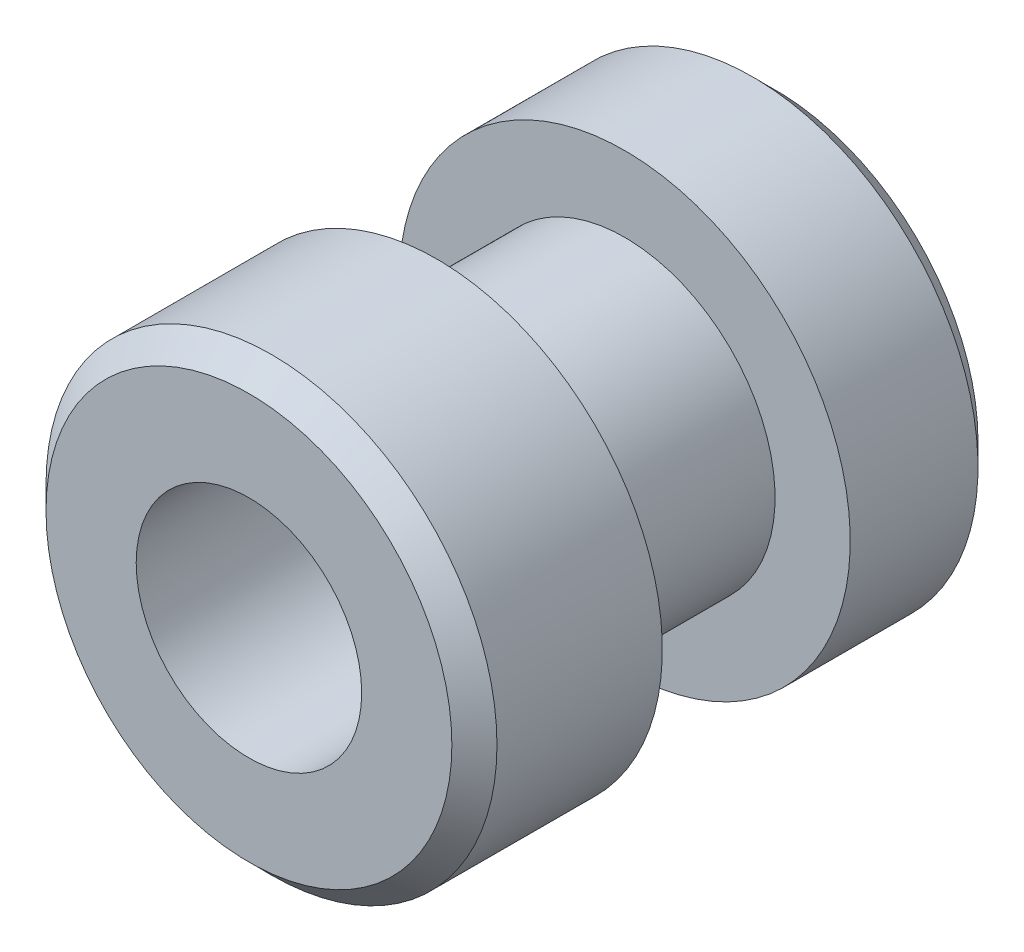
ISO-10303-21;
HEADER;
FILE_DESCRIPTION(('STEP AP214'),'2;1');
FILE_NAME('part.step','',(''),(''),'','','');
FILE_SCHEMA(('AUTOMOTIVE_DESIGN { 1 0 10303 214 1 1 1 1 }'));
ENDSEC;
DATA;
#1=APPLICATION_CONTEXT('core data for automotive mechanical design processes');
#2=APPLICATION_PROTOCOL_DEFINITION('international standard','automotive_design',2000,#1);
#3=PRODUCT_CONTEXT('',#1,'mechanical');
#4=PRODUCT('Part','Part','',(#3));
#5=PRODUCT_RELATED_PRODUCT_CATEGORY('part','',(#4));
#6=PRODUCT_DEFINITION_FORMATION('','',#4);
#7=PRODUCT_DEFINITION_CONTEXT('part definition',#1,'design');
#8=PRODUCT_DEFINITION('design','',#6,#7);
#9=PRODUCT_DEFINITION_SHAPE('','',#8);
#10=(LENGTH_UNIT() NAMED_UNIT(*) SI_UNIT(.MILLI.,.METRE.));
#11=(NAMED_UNIT(*) PLANE_ANGLE_UNIT() SI_UNIT($,.RADIAN.));
#12=(NAMED_UNIT(*) SI_UNIT($,.STERADIAN.) SOLID_ANGLE_UNIT());
#13=UNCERTAINTY_MEASURE_WITH_UNIT(LENGTH_MEASURE(1.E-05),#10,'distance_accuracy_value','');
#14=(GEOMETRIC_REPRESENTATION_CONTEXT(3) GLOBAL_UNCERTAINTY_ASSIGNED_CONTEXT((#13)) GLOBAL_UNIT_ASSIGNED_CONTEXT((#10,
#11,#12)) REPRESENTATION_CONTEXT('',''));
#15=CARTESIAN_POINT('',(0.,0.,0.));
#16=DIRECTION('',(0.,0.,1.));
#17=DIRECTION('',(1.,0.,0.));
#18=AXIS2_PLACEMENT_3D('',#15,#16,#17);
#19=CARTESIAN_POINT('',(0.,0.,-2.41303441791942));
#20=DIRECTION('',(0.,0.,-1.));
#21=DIRECTION('',(-1.,0.,0.));
#22=AXIS2_PLACEMENT_3D('',#19,#20,#21);
#23=CYLINDRICAL_SURFACE('',#22,3.);
#24=CARTESIAN_POINT('',(0.,0.,-0.300000000000001));
#25=DIRECTION('',(0.,0.,1.));
#26=DIRECTION('',(1.,0.,0.));
#27=AXIS2_PLACEMENT_3D('',#24,#25,#26);
#28=CIRCLE('',#27,3.);
#29=CARTESIAN_POINT('',(3.,0.,-0.300000000000001));
#30=VERTEX_POINT('',#29);
#31=EDGE_CURVE('E54',#30,#30,#28,.F.);
#32=ORIENTED_EDGE('',*,*,#31,.T.);
#33=EDGE_LOOP('',(#32));
#34=FACE_BOUND('',#33,.T.);
#35=CARTESIAN_POINT('',(0.,0.,-2.5));
#36=DIRECTION('',(0.,0.,-1.));
#37=DIRECTION('',(-1.,0.,0.));
#38=AXIS2_PLACEMENT_3D('',#35,#36,#37);
#39=CIRCLE('',#38,3.);
#40=CARTESIAN_POINT('',(-3.,0.,-2.5));
#41=VERTEX_POINT('',#40);
#42=EDGE_CURVE('E74',#41,#41,#39,.T.);
#43=ORIENTED_EDGE('',*,*,#42,.F.);
#44=EDGE_LOOP('',(#43));
#45=FACE_BOUND('',#44,.T.);
#46=ADVANCED_FACE('F38',(#34,#45),#23,.T.);
#47=CARTESIAN_POINT('',(-3.,0.,0.));
#48=DIRECTION('',(0.,0.,1.));
#49=DIRECTION('',(1.,0.,0.));
#50=AXIS2_PLACEMENT_3D('',#47,#48,#49);
#51=PLANE('',#50);
#52=CARTESIAN_POINT('',(0.,0.,0.));
#53=DIRECTION('',(0.,0.,1.));
#54=DIRECTION('',(1.,0.,0.));
#55=AXIS2_PLACEMENT_3D('',#52,#53,#54);
#56=CIRCLE('',#55,2.7);
#57=CARTESIAN_POINT('',(2.7,0.,0.));
#58=VERTEX_POINT('',#57);
#59=EDGE_CURVE('E50',#58,#58,#56,.T.);
#60=ORIENTED_EDGE('',*,*,#59,.T.);
#61=EDGE_LOOP('',(#60));
#62=FACE_BOUND('',#61,.T.);
#63=CARTESIAN_POINT('',(0.,0.,0.));
#64=DIRECTION('',(0.,0.,-1.));
#65=DIRECTION('',(-1.,0.,0.));
#66=AXIS2_PLACEMENT_3D('',#63,#64,#65);
#67=CIRCLE('',#66,1.5);
#68=CARTESIAN_POINT('',(-1.5,0.,0.));
#69=VERTEX_POINT('',#68);
#70=EDGE_CURVE('E59',#69,#69,#67,.T.);
#71=ORIENTED_EDGE('',*,*,#70,.T.);
#72=EDGE_LOOP('',(#71));
#73=FACE_BOUND('',#72,.T.);
#74=ADVANCED_FACE('F82',(#62,#73),#51,.T.);
#75=CARTESIAN_POINT('',(0.,0.,-2.41303441791942));
#76=DIRECTION('',(0.,0.,-1.));
#77=DIRECTION('',(-1.,0.,0.));
#78=AXIS2_PLACEMENT_3D('',#75,#76,#77);
#79=CYLINDRICAL_SURFACE('',#78,1.5);
#80=CARTESIAN_POINT('',(0.,0.,-7.));
#81=DIRECTION('',(0.,0.,-1.));
#82=DIRECTION('',(-1.,0.,0.));
#83=AXIS2_PLACEMENT_3D('',#80,#81,#82);
#84=CIRCLE('',#83,1.5);
#85=CARTESIAN_POINT('',(-1.5,0.,-7.));
#86=VERTEX_POINT('',#85);
#87=EDGE_CURVE('E62',#86,#86,#84,.T.);
#88=ORIENTED_EDGE('',*,*,#87,.T.);
#89=EDGE_LOOP('',(#88));
#90=FACE_BOUND('',#89,.T.);
#91=ORIENTED_EDGE('',*,*,#70,.F.);
#92=EDGE_LOOP('',(#91));
#93=FACE_BOUND('',#92,.T.);
#94=ADVANCED_FACE('F88',(#90,#93),#79,.F.);
#95=CARTESIAN_POINT('',(-1.5,0.,-7.));
#96=DIRECTION('',(0.,0.,-1.));
#97=DIRECTION('',(-1.,0.,0.));
#98=AXIS2_PLACEMENT_3D('',#95,#96,#97);
#99=PLANE('',#98);
#100=CARTESIAN_POINT('',(0.,0.,-7.));
#101=DIRECTION('',(0.,0.,-1.));
#102=DIRECTION('',(-1.,0.,0.));
#103=AXIS2_PLACEMENT_3D('',#100,#101,#102);
#104=CIRCLE('',#103,2.7);
#105=CARTESIAN_POINT('',(-2.7,0.,-7.));
#106=VERTEX_POINT('',#105);
#107=EDGE_CURVE('E46',#106,#106,#104,.T.);
#108=ORIENTED_EDGE('',*,*,#107,.T.);
#109=EDGE_LOOP('',(#108));
#110=FACE_BOUND('',#109,.T.);
#111=ORIENTED_EDGE('',*,*,#87,.F.);
#112=EDGE_LOOP('',(#111));
#113=FACE_BOUND('',#112,.T.);
#114=ADVANCED_FACE('F112',(#110,#113),#99,.T.);
#115=CARTESIAN_POINT('',(0.,0.,-2.41303441791942));
#116=DIRECTION('',(0.,0.,-1.));
#117=DIRECTION('',(-1.,0.,0.));
#118=AXIS2_PLACEMENT_3D('',#115,#116,#117);
#119=CYLINDRICAL_SURFACE('',#118,3.);
#120=CARTESIAN_POINT('',(0.,0.,-6.7));
#121=DIRECTION('',(0.,0.,-1.));
#122=DIRECTION('',(-1.,0.,0.));
#123=AXIS2_PLACEMENT_3D('',#120,#121,#122);
#124=CIRCLE('',#123,3.);
#125=CARTESIAN_POINT('',(-3.,0.,-6.7));
#126=VERTEX_POINT('',#125);
#127=EDGE_CURVE('E10',#126,#126,#124,.F.);
#128=ORIENTED_EDGE('',*,*,#127,.T.);
#129=EDGE_LOOP('',(#128));
#130=FACE_BOUND('',#129,.T.);
#131=CARTESIAN_POINT('',(0.,0.,-5.));
#132=DIRECTION('',(0.,0.,-1.));
#133=DIRECTION('',(-1.,0.,0.));
#134=AXIS2_PLACEMENT_3D('',#131,#132,#133);
#135=CIRCLE('',#134,3.);
#136=CARTESIAN_POINT('',(-3.,0.,-5.));
#137=VERTEX_POINT('',#136);
#138=EDGE_CURVE('E65',#137,#137,#135,.T.);
#139=ORIENTED_EDGE('',*,*,#138,.T.);
#140=EDGE_LOOP('',(#139));
#141=FACE_BOUND('',#140,.T.);
#142=ADVANCED_FACE('F117',(#130,#141),#119,.T.);
#143=CARTESIAN_POINT('',(-3.,0.,-5.));
#144=DIRECTION('',(0.,0.,1.));
#145=DIRECTION('',(1.,0.,0.));
#146=AXIS2_PLACEMENT_3D('',#143,#144,#145);
#147=PLANE('',#146);
#148=CARTESIAN_POINT('',(0.,0.,-5.));
#149=DIRECTION('',(0.,0.,-1.));
#150=DIRECTION('',(-1.,0.,0.));
#151=AXIS2_PLACEMENT_3D('',#148,#149,#150);
#152=CIRCLE('',#151,2.);
#153=CARTESIAN_POINT('',(-2.,0.,-5.));
#154=VERTEX_POINT('',#153);
#155=EDGE_CURVE('E68',#154,#154,#152,.T.);
#156=ORIENTED_EDGE('',*,*,#155,.T.);
#157=EDGE_LOOP('',(#156));
#158=FACE_BOUND('',#157,.T.);
#159=ORIENTED_EDGE('',*,*,#138,.F.);
#160=EDGE_LOOP('',(#159));
#161=FACE_BOUND('',#160,.T.);
#162=ADVANCED_FACE('F122',(#158,#161),#147,.T.);
#163=CARTESIAN_POINT('',(0.,0.,-2.41303441791942));
#164=DIRECTION('',(0.,0.,-1.));
#165=DIRECTION('',(-1.,0.,0.));
#166=AXIS2_PLACEMENT_3D('',#163,#164,#165);
#167=CYLINDRICAL_SURFACE('',#166,2.);
#168=CARTESIAN_POINT('',(0.,0.,-2.5));
#169=DIRECTION('',(0.,0.,-1.));
#170=DIRECTION('',(-1.,0.,0.));
#171=AXIS2_PLACEMENT_3D('',#168,#169,#170);
#172=CIRCLE('',#171,2.);
#173=CARTESIAN_POINT('',(-2.,0.,-2.5));
#174=VERTEX_POINT('',#173);
#175=EDGE_CURVE('E71',#174,#174,#172,.T.);
#176=ORIENTED_EDGE('',*,*,#175,.T.);
#177=EDGE_LOOP('',(#176));
#178=FACE_BOUND('',#177,.T.);
#179=ORIENTED_EDGE('',*,*,#155,.F.);
#180=EDGE_LOOP('',(#179));
#181=FACE_BOUND('',#180,.T.);
#182=ADVANCED_FACE('F103',(#178,#181),#167,.T.);
#183=CARTESIAN_POINT('',(-2.,0.,-2.5));
#184=DIRECTION('',(0.,0.,-1.));
#185=DIRECTION('',(-1.,0.,0.));
#186=AXIS2_PLACEMENT_3D('',#183,#184,#185);
#187=PLANE('',#186);
#188=ORIENTED_EDGE('',*,*,#42,.T.);
#189=EDGE_LOOP('',(#188));
#190=FACE_BOUND('',#189,.T.);
#191=ORIENTED_EDGE('',*,*,#175,.F.);
#192=EDGE_LOOP('',(#191));
#193=FACE_BOUND('',#192,.T.);
#194=ADVANCED_FACE('F78',(#190,#193),#187,.T.);
#195=CARTESIAN_POINT('',(0.,0.,-0.300000000000001));
#196=DIRECTION('',(0.,0.,-1.));
#197=DIRECTION('',(-1.,0.,0.));
#198=AXIS2_PLACEMENT_3D('',#195,#196,#197);
#199=CONICAL_SURFACE('',#198,3.,0.78539816339745);
#200=ORIENTED_EDGE('',*,*,#59,.F.);
#201=EDGE_LOOP('',(#200));
#202=FACE_BOUND('',#201,.T.);
#203=ORIENTED_EDGE('',*,*,#31,.F.);
#204=EDGE_LOOP('',(#203));
#205=FACE_BOUND('',#204,.T.);
#206=ADVANCED_FACE('F93',(#202,#205),#199,.T.);
#207=CARTESIAN_POINT('',(0.,0.,-7.));
#208=DIRECTION('',(0.,0.,1.));
#209=DIRECTION('',(1.,0.,0.));
#210=AXIS2_PLACEMENT_3D('',#207,#208,#209);
#211=CONICAL_SURFACE('',#210,2.7,0.785398163397445);
#212=ORIENTED_EDGE('',*,*,#127,.F.);
#213=EDGE_LOOP('',(#212));
#214=FACE_BOUND('',#213,.T.);
#215=ORIENTED_EDGE('',*,*,#107,.F.);
#216=EDGE_LOOP('',(#215));
#217=FACE_BOUND('',#216,.T.);
#218=ADVANCED_FACE('F41',(#214,#217),#211,.T.);
#219=CLOSED_SHELL('',(#46,#74,#94,#114,#142,#162,#182,#194,#206,#218));
#220=MANIFOLD_SOLID_BREP('B2',#219);
#221=ADVANCED_BREP_SHAPE_REPRESENTATION('',(#18,#220),#14);
#222=SHAPE_DEFINITION_REPRESENTATION(#9,#221);
ENDSEC;
END-ISO-10303-21;
